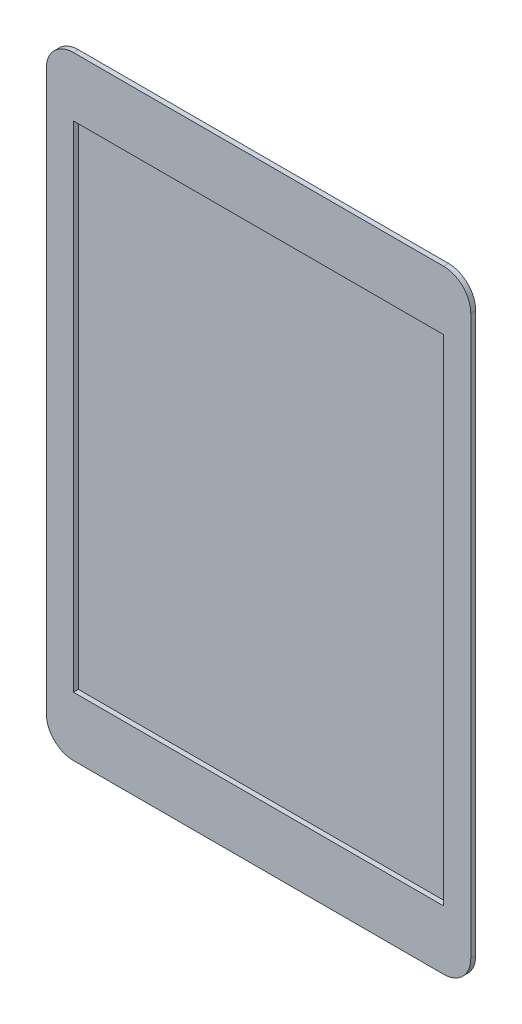
ISO-10303-21;
HEADER;
FILE_DESCRIPTION(('STEP AP214'),'2;1');
FILE_NAME('part.step','',(''),(''),'','','');
FILE_SCHEMA(('AUTOMOTIVE_DESIGN { 1 0 10303 214 1 1 1 1 }'));
ENDSEC;
DATA;
#1=APPLICATION_CONTEXT('core data for automotive mechanical design processes');
#2=APPLICATION_PROTOCOL_DEFINITION('international standard','automotive_design',2000,#1);
#3=PRODUCT_CONTEXT('',#1,'mechanical');
#4=PRODUCT('Part','Part','',(#3));
#5=PRODUCT_RELATED_PRODUCT_CATEGORY('part','',(#4));
#6=PRODUCT_DEFINITION_FORMATION('','',#4);
#7=PRODUCT_DEFINITION_CONTEXT('part definition',#1,'design');
#8=PRODUCT_DEFINITION('design','',#6,#7);
#9=PRODUCT_DEFINITION_SHAPE('','',#8);
#10=(LENGTH_UNIT() NAMED_UNIT(*) SI_UNIT(.MILLI.,.METRE.));
#11=(NAMED_UNIT(*) PLANE_ANGLE_UNIT() SI_UNIT($,.RADIAN.));
#12=(NAMED_UNIT(*) SI_UNIT($,.STERADIAN.) SOLID_ANGLE_UNIT());
#13=UNCERTAINTY_MEASURE_WITH_UNIT(LENGTH_MEASURE(1.E-05),#10,'distance_accuracy_value','');
#14=(GEOMETRIC_REPRESENTATION_CONTEXT(3) GLOBAL_UNCERTAINTY_ASSIGNED_CONTEXT((#13)) GLOBAL_UNIT_ASSIGNED_CONTEXT((#10,
#11,#12)) REPRESENTATION_CONTEXT('',''));
#15=CARTESIAN_POINT('',(0.,0.,0.));
#16=DIRECTION('',(0.,0.,1.));
#17=DIRECTION('',(1.,0.,0.));
#18=AXIS2_PLACEMENT_3D('',#15,#16,#17);
#19=CARTESIAN_POINT('',(75.05,-100.3,-0.1));
#20=DIRECTION('',(1.,0.,0.));
#21=DIRECTION('',(0.,0.,-1.));
#22=AXIS2_PLACEMENT_3D('',#19,#20,#21);
#23=PLANE('',#22);
#24=DIRECTION('',(0.,1.,0.));
#25=VECTOR('',#24,1.);
#26=CARTESIAN_POINT('',(75.05,-100.3,0.));
#27=LINE('',#26,#25);
#28=CARTESIAN_POINT('',(75.05,-100.3,0.));
#29=VERTEX_POINT('',#28);
#30=CARTESIAN_POINT('',(75.05,100.3,0.));
#31=VERTEX_POINT('',#30);
#32=EDGE_CURVE('E114',#29,#31,#27,.T.);
#33=ORIENTED_EDGE('',*,*,#32,.F.);
#34=DIRECTION('',(0.,0.,1.));
#35=VECTOR('',#34,1.);
#36=CARTESIAN_POINT('',(75.05,-100.3,-0.1));
#37=LINE('',#36,#35);
#38=CARTESIAN_POINT('',(75.05,-100.3,-0.1));
#39=VERTEX_POINT('',#38);
#40=EDGE_CURVE('E12',#39,#29,#37,.T.);
#41=ORIENTED_EDGE('',*,*,#40,.F.);
#42=DIRECTION('',(0.,1.,0.));
#43=VECTOR('',#42,1.);
#44=CARTESIAN_POINT('',(75.05,-100.3,-0.1));
#45=LINE('',#44,#43);
#46=CARTESIAN_POINT('',(75.05,100.3,-0.1));
#47=VERTEX_POINT('',#46);
#48=EDGE_CURVE('E108',#39,#47,#45,.T.);
#49=ORIENTED_EDGE('',*,*,#48,.T.);
#50=DIRECTION('',(0.,0.,1.));
#51=VECTOR('',#50,1.);
#52=CARTESIAN_POINT('',(75.05,100.3,-0.1));
#53=LINE('',#52,#51);
#54=EDGE_CURVE('E53',#47,#31,#53,.T.);
#55=ORIENTED_EDGE('',*,*,#54,.T.);
#56=EDGE_LOOP('',(#33,#41,#49,#55));
#57=FACE_BOUND('',#56,.T.);
#58=ADVANCED_FACE('F50',(#57),#23,.T.);
#59=CARTESIAN_POINT('',(-75.05,-100.3,-0.1));
#60=DIRECTION('',(0.,-1.,0.));
#61=DIRECTION('',(0.,0.,-1.));
#62=AXIS2_PLACEMENT_3D('',#59,#60,#61);
#63=PLANE('',#62);
#64=DIRECTION('',(1.,0.,0.));
#65=VECTOR('',#64,1.);
#66=CARTESIAN_POINT('',(-75.05,-100.3,0.));
#67=LINE('',#66,#65);
#68=CARTESIAN_POINT('',(-75.05,-100.3,0.));
#69=VERTEX_POINT('',#68);
#70=EDGE_CURVE('E110',#69,#29,#67,.T.);
#71=ORIENTED_EDGE('',*,*,#70,.F.);
#72=DIRECTION('',(0.,0.,1.));
#73=VECTOR('',#72,1.);
#74=CARTESIAN_POINT('',(-75.05,-100.3,-0.1));
#75=LINE('',#74,#73);
#76=CARTESIAN_POINT('',(-75.05,-100.3,-0.1));
#77=VERTEX_POINT('',#76);
#78=EDGE_CURVE('E59',#77,#69,#75,.T.);
#79=ORIENTED_EDGE('',*,*,#78,.F.);
#80=DIRECTION('',(1.,0.,0.));
#81=VECTOR('',#80,1.);
#82=CARTESIAN_POINT('',(-75.05,-100.3,-0.1));
#83=LINE('',#82,#81);
#84=EDGE_CURVE('E105',#77,#39,#83,.T.);
#85=ORIENTED_EDGE('',*,*,#84,.T.);
#86=ORIENTED_EDGE('',*,*,#40,.T.);
#87=EDGE_LOOP('',(#71,#79,#85,#86));
#88=FACE_BOUND('',#87,.T.);
#89=ADVANCED_FACE('F124',(#88),#63,.T.);
#90=CARTESIAN_POINT('',(-75.05,-100.3,-0.1));
#91=DIRECTION('',(-1.,0.,0.));
#92=DIRECTION('',(0.,0.,1.));
#93=AXIS2_PLACEMENT_3D('',#90,#91,#92);
#94=PLANE('',#93);
#95=DIRECTION('',(0.,-1.,0.));
#96=VECTOR('',#95,1.);
#97=CARTESIAN_POINT('',(-75.05,-100.3,0.));
#98=LINE('',#97,#96);
#99=CARTESIAN_POINT('',(-75.05,100.3,0.));
#100=VERTEX_POINT('',#99);
#101=EDGE_CURVE('E100',#100,#69,#98,.T.);
#102=ORIENTED_EDGE('',*,*,#101,.F.);
#103=DIRECTION('',(0.,0.,1.));
#104=VECTOR('',#103,1.);
#105=CARTESIAN_POINT('',(-75.05,100.3,-0.1));
#106=LINE('',#105,#104);
#107=CARTESIAN_POINT('',(-75.05,100.3,-0.1));
#108=VERTEX_POINT('',#107);
#109=EDGE_CURVE('E95',#108,#100,#106,.T.);
#110=ORIENTED_EDGE('',*,*,#109,.F.);
#111=DIRECTION('',(0.,-1.,0.));
#112=VECTOR('',#111,1.);
#113=CARTESIAN_POINT('',(-75.05,-100.3,-0.1));
#114=LINE('',#113,#112);
#115=EDGE_CURVE('E98',#108,#77,#114,.T.);
#116=ORIENTED_EDGE('',*,*,#115,.T.);
#117=ORIENTED_EDGE('',*,*,#78,.T.);
#118=EDGE_LOOP('',(#102,#110,#116,#117));
#119=FACE_BOUND('',#118,.T.);
#120=ADVANCED_FACE('F97',(#119),#94,.T.);
#121=CARTESIAN_POINT('',(-75.05,100.3,-0.1));
#122=DIRECTION('',(0.,1.,0.));
#123=DIRECTION('',(0.,0.,1.));
#124=AXIS2_PLACEMENT_3D('',#121,#122,#123);
#125=PLANE('',#124);
#126=DIRECTION('',(-1.,0.,0.));
#127=VECTOR('',#126,1.);
#128=CARTESIAN_POINT('',(-75.05,100.3,0.));
#129=LINE('',#128,#127);
#130=EDGE_CURVE('E117',#31,#100,#129,.T.);
#131=ORIENTED_EDGE('',*,*,#130,.F.);
#132=ORIENTED_EDGE('',*,*,#54,.F.);
#133=DIRECTION('',(-1.,0.,0.));
#134=VECTOR('',#133,1.);
#135=CARTESIAN_POINT('',(-75.05,100.3,-0.1));
#136=LINE('',#135,#134);
#137=EDGE_CURVE('E104',#47,#108,#136,.T.);
#138=ORIENTED_EDGE('',*,*,#137,.T.);
#139=ORIENTED_EDGE('',*,*,#109,.T.);
#140=EDGE_LOOP('',(#131,#132,#138,#139));
#141=FACE_BOUND('',#140,.T.);
#142=ADVANCED_FACE('F107',(#141),#125,.T.);
#143=CARTESIAN_POINT('',(0.,0.,-0.1));
#144=DIRECTION('',(0.,0.,-1.));
#145=DIRECTION('',(-1.,0.,0.));
#146=AXIS2_PLACEMENT_3D('',#143,#144,#145);
#147=PLANE('',#146);
#148=ORIENTED_EDGE('',*,*,#48,.F.);
#149=ORIENTED_EDGE('',*,*,#84,.F.);
#150=ORIENTED_EDGE('',*,*,#115,.F.);
#151=ORIENTED_EDGE('',*,*,#137,.F.);
#152=EDGE_LOOP('',(#148,#149,#150,#151));
#153=FACE_BOUND('',#152,.T.);
#154=ADVANCED_FACE('F103',(#153),#147,.T.);
#155=CARTESIAN_POINT('',(0.,0.,0.));
#156=DIRECTION('',(0.,0.,-1.));
#157=DIRECTION('',(-1.,0.,0.));
#158=AXIS2_PLACEMENT_3D('',#155,#156,#157);
#159=PLANE('',#158);
#160=ORIENTED_EDGE('',*,*,#32,.T.);
#161=ORIENTED_EDGE('',*,*,#130,.T.);
#162=ORIENTED_EDGE('',*,*,#101,.T.);
#163=ORIENTED_EDGE('',*,*,#70,.T.);
#164=EDGE_LOOP('',(#160,#161,#162,#163));
#165=FACE_BOUND('',#164,.T.);
#166=ADVANCED_FACE('F123',(#165),#159,.F.);
#167=CLOSED_SHELL('',(#58,#89,#120,#142,#154,#166));
#168=MANIFOLD_SOLID_BREP('B2',#167);
#169=CARTESIAN_POINT('',(-75.05,-113.3,2.));
#170=DIRECTION('',(0.,0.,1.));
#171=DIRECTION('',(1.,0.,0.));
#172=AXIS2_PLACEMENT_3D('',#169,#170,#171);
#173=PLANE('',#172);
#174=CARTESIAN_POINT('',(-75.05,-113.3,2.));
#175=DIRECTION('',(0.,0.,1.));
#176=DIRECTION('',(1.,0.,0.));
#177=AXIS2_PLACEMENT_3D('',#174,#175,#176);
#178=CIRCLE('',#177,11.);
#179=CARTESIAN_POINT('',(-86.05,-113.3,2.));
#180=VERTEX_POINT('',#179);
#181=CARTESIAN_POINT('',(-75.05,-124.3,2.));
#182=VERTEX_POINT('',#181);
#183=EDGE_CURVE('E304',#180,#182,#178,.T.);
#184=ORIENTED_EDGE('',*,*,#183,.T.);
#185=DIRECTION('',(1.,0.,0.));
#186=VECTOR('',#185,1.);
#187=CARTESIAN_POINT('',(-75.05,-124.3,2.));
#188=LINE('',#187,#186);
#189=CARTESIAN_POINT('',(75.05,-124.3,2.));
#190=VERTEX_POINT('',#189);
#191=EDGE_CURVE('E307',#182,#190,#188,.T.);
#192=ORIENTED_EDGE('',*,*,#191,.T.);
#193=CARTESIAN_POINT('',(75.05,-113.3,2.));
#194=DIRECTION('',(0.,0.,1.));
#195=DIRECTION('',(1.,0.,0.));
#196=AXIS2_PLACEMENT_3D('',#193,#194,#195);
#197=CIRCLE('',#196,11.);
#198=CARTESIAN_POINT('',(86.05,-113.3,2.));
#199=VERTEX_POINT('',#198);
#200=EDGE_CURVE('E310',#190,#199,#197,.T.);
#201=ORIENTED_EDGE('',*,*,#200,.T.);
#202=DIRECTION('',(0.,1.,0.));
#203=VECTOR('',#202,1.);
#204=CARTESIAN_POINT('',(86.05,113.3,2.));
#205=LINE('',#204,#203);
#206=CARTESIAN_POINT('',(86.05,113.3,2.));
#207=VERTEX_POINT('',#206);
#208=EDGE_CURVE('E312',#199,#207,#205,.T.);
#209=ORIENTED_EDGE('',*,*,#208,.T.);
#210=CARTESIAN_POINT('',(75.05,113.3,2.));
#211=DIRECTION('',(0.,0.,1.));
#212=DIRECTION('',(-1.,0.,0.));
#213=AXIS2_PLACEMENT_3D('',#210,#211,#212);
#214=CIRCLE('',#213,11.);
#215=CARTESIAN_POINT('',(75.05,124.3,2.));
#216=VERTEX_POINT('',#215);
#217=EDGE_CURVE('E314',#207,#216,#214,.T.);
#218=ORIENTED_EDGE('',*,*,#217,.T.);
#219=DIRECTION('',(-1.,0.,0.));
#220=VECTOR('',#219,1.);
#221=CARTESIAN_POINT('',(-75.05,124.3,2.));
#222=LINE('',#221,#220);
#223=CARTESIAN_POINT('',(-75.05,124.3,2.));
#224=VERTEX_POINT('',#223);
#225=EDGE_CURVE('E316',#216,#224,#222,.T.);
#226=ORIENTED_EDGE('',*,*,#225,.T.);
#227=CARTESIAN_POINT('',(-75.05,113.3,2.));
#228=DIRECTION('',(0.,0.,1.));
#229=DIRECTION('',(1.,0.,0.));
#230=AXIS2_PLACEMENT_3D('',#227,#228,#229);
#231=CIRCLE('',#230,11.);
#232=CARTESIAN_POINT('',(-86.05,113.3,2.));
#233=VERTEX_POINT('',#232);
#234=EDGE_CURVE('E318',#224,#233,#231,.T.);
#235=ORIENTED_EDGE('',*,*,#234,.T.);
#236=DIRECTION('',(0.,-1.,0.));
#237=VECTOR('',#236,1.);
#238=CARTESIAN_POINT('',(-86.05,113.3,2.));
#239=LINE('',#238,#237);
#240=EDGE_CURVE('E320',#233,#180,#239,.T.);
#241=ORIENTED_EDGE('',*,*,#240,.T.);
#242=EDGE_LOOP('',(#184,#192,#201,#209,#218,#226,#235,#241));
#243=FACE_BOUND('',#242,.T.);
#244=DIRECTION('',(-1.,0.,0.));
#245=VECTOR('',#244,1.);
#246=CARTESIAN_POINT('',(-75.05,100.3,2.));
#247=LINE('',#246,#245);
#248=CARTESIAN_POINT('',(75.05,100.3,2.));
#249=VERTEX_POINT('',#248);
#250=CARTESIAN_POINT('',(-75.05,100.3,2.));
#251=VERTEX_POINT('',#250);
#252=EDGE_CURVE('E274',#249,#251,#247,.T.);
#253=ORIENTED_EDGE('',*,*,#252,.F.);
#254=DIRECTION('',(0.,1.,0.));
#255=VECTOR('',#254,1.);
#256=CARTESIAN_POINT('',(75.05,100.3,2.));
#257=LINE('',#256,#255);
#258=CARTESIAN_POINT('',(75.05,-100.3,2.));
#259=VERTEX_POINT('',#258);
#260=EDGE_CURVE('E266',#259,#249,#257,.T.);
#261=ORIENTED_EDGE('',*,*,#260,.F.);
#262=DIRECTION('',(1.,0.,0.));
#263=VECTOR('',#262,1.);
#264=CARTESIAN_POINT('',(-75.05,-100.3,2.));
#265=LINE('',#264,#263);
#266=CARTESIAN_POINT('',(-75.05,-100.3,2.));
#267=VERTEX_POINT('',#266);
#268=EDGE_CURVE('E288',#267,#259,#265,.T.);
#269=ORIENTED_EDGE('',*,*,#268,.F.);
#270=DIRECTION('',(0.,-1.,0.));
#271=VECTOR('',#270,1.);
#272=CARTESIAN_POINT('',(-75.05,100.3,2.));
#273=LINE('',#272,#271);
#274=EDGE_CURVE('E286',#251,#267,#273,.T.);
#275=ORIENTED_EDGE('',*,*,#274,.F.);
#276=EDGE_LOOP('',(#253,#261,#269,#275));
#277=FACE_BOUND('',#276,.T.);
#278=ADVANCED_FACE('F177',(#243,#277),#173,.T.);
#279=CARTESIAN_POINT('',(-75.05,-113.3,0.));
#280=DIRECTION('',(0.,0.,1.));
#281=DIRECTION('',(1.,0.,0.));
#282=AXIS2_PLACEMENT_3D('',#279,#280,#281);
#283=PLANE('',#282);
#284=CARTESIAN_POINT('',(0.,112.85975777195,0.));
#285=DIRECTION('',(0.,0.,-1.));
#286=DIRECTION('',(-1.,0.,0.));
#287=AXIS2_PLACEMENT_3D('',#284,#285,#286);
#288=CIRCLE('',#287,1.5);
#289=CARTESIAN_POINT('',(-1.5,112.85975777195,0.));
#290=VERTEX_POINT('',#289);
#291=EDGE_CURVE('E637',#290,#290,#288,.T.);
#292=ORIENTED_EDGE('',*,*,#291,.F.);
#293=EDGE_LOOP('',(#292));
#294=FACE_BOUND('',#293,.T.);
#295=CARTESIAN_POINT('',(0.,-111.8,0.));
#296=DIRECTION('',(0.,0.,1.));
#297=DIRECTION('',(1.,0.,0.));
#298=AXIS2_PLACEMENT_3D('',#295,#296,#297);
#299=CIRCLE('',#298,5.501);
#300=CARTESIAN_POINT('',(5.501,-111.8,0.));
#301=VERTEX_POINT('',#300);
#302=EDGE_CURVE('E370',#301,#301,#299,.T.);
#303=ORIENTED_EDGE('',*,*,#302,.T.);
#304=EDGE_LOOP('',(#303));
#305=FACE_BOUND('',#304,.T.);
#306=CARTESIAN_POINT('',(-75.05,-113.3,0.));
#307=DIRECTION('',(0.,0.,1.));
#308=DIRECTION('',(1.,0.,0.));
#309=AXIS2_PLACEMENT_3D('',#306,#307,#308);
#310=CIRCLE('',#309,11.);
#311=CARTESIAN_POINT('',(-86.05,-113.3,0.));
#312=VERTEX_POINT('',#311);
#313=CARTESIAN_POINT('',(-75.05,-124.3,0.));
#314=VERTEX_POINT('',#313);
#315=EDGE_CURVE('E282',#312,#314,#310,.T.);
#316=ORIENTED_EDGE('',*,*,#315,.F.);
#317=DIRECTION('',(0.,-1.,0.));
#318=VECTOR('',#317,1.);
#319=CARTESIAN_POINT('',(-86.05,113.3,0.));
#320=LINE('',#319,#318);
#321=CARTESIAN_POINT('',(-86.05,113.3,0.));
#322=VERTEX_POINT('',#321);
#323=EDGE_CURVE('E308',#322,#312,#320,.T.);
#324=ORIENTED_EDGE('',*,*,#323,.F.);
#325=CARTESIAN_POINT('',(-75.05,113.3,0.));
#326=DIRECTION('',(0.,0.,1.));
#327=DIRECTION('',(1.,0.,0.));
#328=AXIS2_PLACEMENT_3D('',#325,#326,#327);
#329=CIRCLE('',#328,11.);
#330=CARTESIAN_POINT('',(-75.05,124.3,0.));
#331=VERTEX_POINT('',#330);
#332=EDGE_CURVE('E335',#331,#322,#329,.T.);
#333=ORIENTED_EDGE('',*,*,#332,.F.);
#334=DIRECTION('',(-1.,0.,0.));
#335=VECTOR('',#334,1.);
#336=CARTESIAN_POINT('',(-75.05,124.3,0.));
#337=LINE('',#336,#335);
#338=CARTESIAN_POINT('',(75.05,124.3,0.));
#339=VERTEX_POINT('',#338);
#340=EDGE_CURVE('E333',#339,#331,#337,.T.);
#341=ORIENTED_EDGE('',*,*,#340,.F.);
#342=CARTESIAN_POINT('',(75.05,113.3,0.));
#343=DIRECTION('',(0.,0.,1.));
#344=DIRECTION('',(-1.,0.,0.));
#345=AXIS2_PLACEMENT_3D('',#342,#343,#344);
#346=CIRCLE('',#345,11.);
#347=CARTESIAN_POINT('',(86.05,113.3,0.));
#348=VERTEX_POINT('',#347);
#349=EDGE_CURVE('E331',#348,#339,#346,.T.);
#350=ORIENTED_EDGE('',*,*,#349,.F.);
#351=DIRECTION('',(0.,1.,0.));
#352=VECTOR('',#351,1.);
#353=CARTESIAN_POINT('',(86.05,113.3,0.));
#354=LINE('',#353,#352);
#355=CARTESIAN_POINT('',(86.05,-113.3,0.));
#356=VERTEX_POINT('',#355);
#357=EDGE_CURVE('E329',#356,#348,#354,.T.);
#358=ORIENTED_EDGE('',*,*,#357,.F.);
#359=CARTESIAN_POINT('',(75.05,-113.3,0.));
#360=DIRECTION('',(0.,0.,1.));
#361=DIRECTION('',(1.,0.,0.));
#362=AXIS2_PLACEMENT_3D('',#359,#360,#361);
#363=CIRCLE('',#362,11.);
#364=CARTESIAN_POINT('',(75.05,-124.3,0.));
#365=VERTEX_POINT('',#364);
#366=EDGE_CURVE('E327',#365,#356,#363,.T.);
#367=ORIENTED_EDGE('',*,*,#366,.F.);
#368=DIRECTION('',(1.,0.,0.));
#369=VECTOR('',#368,1.);
#370=CARTESIAN_POINT('',(-75.05,-124.3,0.));
#371=LINE('',#370,#369);
#372=EDGE_CURVE('E325',#314,#365,#371,.T.);
#373=ORIENTED_EDGE('',*,*,#372,.F.);
#374=EDGE_LOOP('',(#316,#324,#333,#341,#350,#358,#367,#373));
#375=FACE_BOUND('',#374,.T.);
#376=DIRECTION('',(0.,1.,0.));
#377=VECTOR('',#376,1.);
#378=CARTESIAN_POINT('',(75.05,100.3,0.));
#379=LINE('',#378,#377);
#380=CARTESIAN_POINT('',(75.05,-100.3,0.));
#381=VERTEX_POINT('',#380);
#382=CARTESIAN_POINT('',(75.05,100.3,0.));
#383=VERTEX_POINT('',#382);
#384=EDGE_CURVE('E200',#381,#383,#379,.T.);
#385=ORIENTED_EDGE('',*,*,#384,.T.);
#386=DIRECTION('',(-1.,0.,0.));
#387=VECTOR('',#386,1.);
#388=CARTESIAN_POINT('',(-75.05,100.3,0.));
#389=LINE('',#388,#387);
#390=CARTESIAN_POINT('',(-75.05,100.3,0.));
#391=VERTEX_POINT('',#390);
#392=EDGE_CURVE('E281',#383,#391,#389,.T.);
#393=ORIENTED_EDGE('',*,*,#392,.T.);
#394=DIRECTION('',(0.,-1.,0.));
#395=VECTOR('',#394,1.);
#396=CARTESIAN_POINT('',(-75.05,100.3,0.));
#397=LINE('',#396,#395);
#398=CARTESIAN_POINT('',(-75.05,-100.3,0.));
#399=VERTEX_POINT('',#398);
#400=EDGE_CURVE('E296',#391,#399,#397,.T.);
#401=ORIENTED_EDGE('',*,*,#400,.T.);
#402=DIRECTION('',(1.,0.,0.));
#403=VECTOR('',#402,1.);
#404=CARTESIAN_POINT('',(-75.05,-100.3,0.));
#405=LINE('',#404,#403);
#406=EDGE_CURVE('E275',#399,#381,#405,.T.);
#407=ORIENTED_EDGE('',*,*,#406,.T.);
#408=EDGE_LOOP('',(#385,#393,#401,#407));
#409=FACE_BOUND('',#408,.T.);
#410=ADVANCED_FACE('F399',(#294,#305,#375,#409),#283,.F.);
#411=CARTESIAN_POINT('',(-75.05,-113.3,2.));
#412=DIRECTION('',(0.,0.,-1.));
#413=DIRECTION('',(-1.,0.,0.));
#414=AXIS2_PLACEMENT_3D('',#411,#412,#413);
#415=CYLINDRICAL_SURFACE('',#414,11.);
#416=ORIENTED_EDGE('',*,*,#315,.T.);
#417=DIRECTION('',(0.,0.,-1.));
#418=VECTOR('',#417,1.);
#419=CARTESIAN_POINT('',(-75.05,-124.3,2.));
#420=LINE('',#419,#418);
#421=EDGE_CURVE('E358',#182,#314,#420,.T.);
#422=ORIENTED_EDGE('',*,*,#421,.F.);
#423=ORIENTED_EDGE('',*,*,#183,.F.);
#424=DIRECTION('',(0.,0.,-1.));
#425=VECTOR('',#424,1.);
#426=CARTESIAN_POINT('',(-86.05,-113.3,2.));
#427=LINE('',#426,#425);
#428=EDGE_CURVE('E322',#180,#312,#427,.T.);
#429=ORIENTED_EDGE('',*,*,#428,.T.);
#430=EDGE_LOOP('',(#416,#422,#423,#429));
#431=FACE_BOUND('',#430,.T.);
#432=ADVANCED_FACE('F405',(#431),#415,.T.);
#433=CARTESIAN_POINT('',(-75.05,-124.3,2.));
#434=DIRECTION('',(0.,1.,0.));
#435=DIRECTION('',(0.,0.,1.));
#436=AXIS2_PLACEMENT_3D('',#433,#434,#435);
#437=PLANE('',#436);
#438=ORIENTED_EDGE('',*,*,#372,.T.);
#439=DIRECTION('',(0.,0.,-1.));
#440=VECTOR('',#439,1.);
#441=CARTESIAN_POINT('',(75.05,-124.3,2.));
#442=LINE('',#441,#440);
#443=EDGE_CURVE('E355',#190,#365,#442,.T.);
#444=ORIENTED_EDGE('',*,*,#443,.F.);
#445=ORIENTED_EDGE('',*,*,#191,.F.);
#446=ORIENTED_EDGE('',*,*,#421,.T.);
#447=EDGE_LOOP('',(#438,#444,#445,#446));
#448=FACE_BOUND('',#447,.T.);
#449=ADVANCED_FACE('F435',(#448),#437,.F.);
#450=CARTESIAN_POINT('',(75.05,-113.3,2.));
#451=DIRECTION('',(0.,0.,-1.));
#452=DIRECTION('',(-1.,0.,0.));
#453=AXIS2_PLACEMENT_3D('',#450,#451,#452);
#454=CYLINDRICAL_SURFACE('',#453,11.);
#455=ORIENTED_EDGE('',*,*,#366,.T.);
#456=DIRECTION('',(0.,0.,-1.));
#457=VECTOR('',#456,1.);
#458=CARTESIAN_POINT('',(86.05,-113.3,2.));
#459=LINE('',#458,#457);
#460=EDGE_CURVE('E352',#199,#356,#459,.T.);
#461=ORIENTED_EDGE('',*,*,#460,.F.);
#462=ORIENTED_EDGE('',*,*,#200,.F.);
#463=ORIENTED_EDGE('',*,*,#443,.T.);
#464=EDGE_LOOP('',(#455,#461,#462,#463));
#465=FACE_BOUND('',#464,.T.);
#466=ADVANCED_FACE('F431',(#465),#454,.T.);
#467=CARTESIAN_POINT('',(86.05,113.3,2.));
#468=DIRECTION('',(-1.,0.,0.));
#469=DIRECTION('',(0.,-1.,0.));
#470=AXIS2_PLACEMENT_3D('',#467,#468,#469);
#471=PLANE('',#470);
#472=ORIENTED_EDGE('',*,*,#357,.T.);
#473=DIRECTION('',(0.,0.,-1.));
#474=VECTOR('',#473,1.);
#475=CARTESIAN_POINT('',(86.05,113.3,2.));
#476=LINE('',#475,#474);
#477=EDGE_CURVE('E349',#207,#348,#476,.T.);
#478=ORIENTED_EDGE('',*,*,#477,.F.);
#479=ORIENTED_EDGE('',*,*,#208,.F.);
#480=ORIENTED_EDGE('',*,*,#460,.T.);
#481=EDGE_LOOP('',(#472,#478,#479,#480));
#482=FACE_BOUND('',#481,.T.);
#483=ADVANCED_FACE('F427',(#482),#471,.F.);
#484=CARTESIAN_POINT('',(75.05,113.3,2.));
#485=DIRECTION('',(0.,0.,-1.));
#486=DIRECTION('',(-1.,0.,0.));
#487=AXIS2_PLACEMENT_3D('',#484,#485,#486);
#488=CYLINDRICAL_SURFACE('',#487,11.);
#489=ORIENTED_EDGE('',*,*,#349,.T.);
#490=DIRECTION('',(0.,0.,-1.));
#491=VECTOR('',#490,1.);
#492=CARTESIAN_POINT('',(75.05,124.3,2.));
#493=LINE('',#492,#491);
#494=EDGE_CURVE('E346',#216,#339,#493,.T.);
#495=ORIENTED_EDGE('',*,*,#494,.F.);
#496=ORIENTED_EDGE('',*,*,#217,.F.);
#497=ORIENTED_EDGE('',*,*,#477,.T.);
#498=EDGE_LOOP('',(#489,#495,#496,#497));
#499=FACE_BOUND('',#498,.T.);
#500=ADVANCED_FACE('F423',(#499),#488,.T.);
#501=CARTESIAN_POINT('',(-75.05,124.3,2.));
#502=DIRECTION('',(0.,-1.,0.));
#503=DIRECTION('',(0.,0.,-1.));
#504=AXIS2_PLACEMENT_3D('',#501,#502,#503);
#505=PLANE('',#504);
#506=ORIENTED_EDGE('',*,*,#340,.T.);
#507=DIRECTION('',(0.,0.,-1.));
#508=VECTOR('',#507,1.);
#509=CARTESIAN_POINT('',(-75.05,124.3,2.));
#510=LINE('',#509,#508);
#511=EDGE_CURVE('E343',#224,#331,#510,.T.);
#512=ORIENTED_EDGE('',*,*,#511,.F.);
#513=ORIENTED_EDGE('',*,*,#225,.F.);
#514=ORIENTED_EDGE('',*,*,#494,.T.);
#515=EDGE_LOOP('',(#506,#512,#513,#514));
#516=FACE_BOUND('',#515,.T.);
#517=ADVANCED_FACE('F419',(#516),#505,.F.);
#518=CARTESIAN_POINT('',(-75.05,113.3,2.));
#519=DIRECTION('',(0.,0.,-1.));
#520=DIRECTION('',(-1.,0.,0.));
#521=AXIS2_PLACEMENT_3D('',#518,#519,#520);
#522=CYLINDRICAL_SURFACE('',#521,11.);
#523=ORIENTED_EDGE('',*,*,#332,.T.);
#524=DIRECTION('',(0.,0.,-1.));
#525=VECTOR('',#524,1.);
#526=CARTESIAN_POINT('',(-86.05,113.3,2.));
#527=LINE('',#526,#525);
#528=EDGE_CURVE('E340',#233,#322,#527,.T.);
#529=ORIENTED_EDGE('',*,*,#528,.F.);
#530=ORIENTED_EDGE('',*,*,#234,.F.);
#531=ORIENTED_EDGE('',*,*,#511,.T.);
#532=EDGE_LOOP('',(#523,#529,#530,#531));
#533=FACE_BOUND('',#532,.T.);
#534=ADVANCED_FACE('F415',(#533),#522,.T.);
#535=CARTESIAN_POINT('',(-86.05,113.3,2.));
#536=DIRECTION('',(1.,0.,0.));
#537=DIRECTION('',(0.,1.,0.));
#538=AXIS2_PLACEMENT_3D('',#535,#536,#537);
#539=PLANE('',#538);
#540=ORIENTED_EDGE('',*,*,#323,.T.);
#541=ORIENTED_EDGE('',*,*,#428,.F.);
#542=ORIENTED_EDGE('',*,*,#240,.F.);
#543=ORIENTED_EDGE('',*,*,#528,.T.);
#544=EDGE_LOOP('',(#540,#541,#542,#543));
#545=FACE_BOUND('',#544,.T.);
#546=ADVANCED_FACE('F412',(#545),#539,.F.);
#547=CARTESIAN_POINT('',(75.05,100.3,2.));
#548=DIRECTION('',(-1.,0.,0.));
#549=DIRECTION('',(0.,-1.,0.));
#550=AXIS2_PLACEMENT_3D('',#547,#548,#549);
#551=PLANE('',#550);
#552=ORIENTED_EDGE('',*,*,#384,.F.);
#553=DIRECTION('',(0.,0.,-1.));
#554=VECTOR('',#553,1.);
#555=CARTESIAN_POINT('',(75.05,-100.3,2.));
#556=LINE('',#555,#554);
#557=EDGE_CURVE('E270',#259,#381,#556,.T.);
#558=ORIENTED_EDGE('',*,*,#557,.F.);
#559=ORIENTED_EDGE('',*,*,#260,.T.);
#560=DIRECTION('',(0.,0.,-1.));
#561=VECTOR('',#560,1.);
#562=CARTESIAN_POINT('',(75.05,100.3,2.));
#563=LINE('',#562,#561);
#564=EDGE_CURVE('E269',#249,#383,#563,.T.);
#565=ORIENTED_EDGE('',*,*,#564,.T.);
#566=EDGE_LOOP('',(#552,#558,#559,#565));
#567=FACE_BOUND('',#566,.T.);
#568=ADVANCED_FACE('F268',(#567),#551,.T.);
#569=CARTESIAN_POINT('',(-75.05,100.3,2.));
#570=DIRECTION('',(0.,-1.,0.));
#571=DIRECTION('',(0.,0.,-1.));
#572=AXIS2_PLACEMENT_3D('',#569,#570,#571);
#573=PLANE('',#572);
#574=ORIENTED_EDGE('',*,*,#392,.F.);
#575=ORIENTED_EDGE('',*,*,#564,.F.);
#576=ORIENTED_EDGE('',*,*,#252,.T.);
#577=DIRECTION('',(0.,0.,-1.));
#578=VECTOR('',#577,1.);
#579=CARTESIAN_POINT('',(-75.05,100.3,2.));
#580=LINE('',#579,#578);
#581=EDGE_CURVE('E283',#251,#391,#580,.T.);
#582=ORIENTED_EDGE('',*,*,#581,.T.);
#583=EDGE_LOOP('',(#574,#575,#576,#582));
#584=FACE_BOUND('',#583,.T.);
#585=ADVANCED_FACE('F278',(#584),#573,.T.);
#586=CARTESIAN_POINT('',(-75.05,100.3,2.));
#587=DIRECTION('',(1.,0.,0.));
#588=DIRECTION('',(0.,1.,0.));
#589=AXIS2_PLACEMENT_3D('',#586,#587,#588);
#590=PLANE('',#589);
#591=ORIENTED_EDGE('',*,*,#400,.F.);
#592=ORIENTED_EDGE('',*,*,#581,.F.);
#593=ORIENTED_EDGE('',*,*,#274,.T.);
#594=DIRECTION('',(0.,0.,-1.));
#595=VECTOR('',#594,1.);
#596=CARTESIAN_POINT('',(-75.05,-100.3,2.));
#597=LINE('',#596,#595);
#598=EDGE_CURVE('E192',#267,#399,#597,.T.);
#599=ORIENTED_EDGE('',*,*,#598,.T.);
#600=EDGE_LOOP('',(#591,#592,#593,#599));
#601=FACE_BOUND('',#600,.T.);
#602=ADVANCED_FACE('F467',(#601),#590,.T.);
#603=CARTESIAN_POINT('',(-75.05,-100.3,2.));
#604=DIRECTION('',(0.,1.,0.));
#605=DIRECTION('',(0.,0.,1.));
#606=AXIS2_PLACEMENT_3D('',#603,#604,#605);
#607=PLANE('',#606);
#608=ORIENTED_EDGE('',*,*,#406,.F.);
#609=ORIENTED_EDGE('',*,*,#598,.F.);
#610=ORIENTED_EDGE('',*,*,#268,.T.);
#611=ORIENTED_EDGE('',*,*,#557,.T.);
#612=EDGE_LOOP('',(#608,#609,#610,#611));
#613=FACE_BOUND('',#612,.T.);
#614=ADVANCED_FACE('F458',(#613),#607,.T.);
#615=CARTESIAN_POINT('',(0.,-111.8,1.));
#616=DIRECTION('',(0.,0.,-1.));
#617=DIRECTION('',(-1.,0.,0.));
#618=AXIS2_PLACEMENT_3D('',#615,#616,#617);
#619=CYLINDRICAL_SURFACE('',#618,5.5);
#620=CARTESIAN_POINT('',(0.,-111.8,0.999));
#621=DIRECTION('',(0.,0.,-1.));
#622=DIRECTION('',(-1.,0.,0.));
#623=AXIS2_PLACEMENT_3D('',#620,#621,#622);
#624=CIRCLE('',#623,5.5);
#625=CARTESIAN_POINT('',(-5.5,-111.8,0.999));
#626=VERTEX_POINT('',#625);
#627=EDGE_CURVE('E376',#626,#626,#624,.F.);
#628=ORIENTED_EDGE('',*,*,#627,.T.);
#629=EDGE_LOOP('',(#628));
#630=FACE_BOUND('',#629,.T.);
#631=CARTESIAN_POINT('',(0.,-111.8,0.000999999999999916));
#632=DIRECTION('',(0.,0.,1.));
#633=DIRECTION('',(1.,0.,0.));
#634=AXIS2_PLACEMENT_3D('',#631,#632,#633);
#635=CIRCLE('',#634,5.5);
#636=CARTESIAN_POINT('',(5.5,-111.8,0.000999999999999916));
#637=VERTEX_POINT('',#636);
#638=EDGE_CURVE('E367',#637,#637,#635,.F.);
#639=ORIENTED_EDGE('',*,*,#638,.T.);
#640=EDGE_LOOP('',(#639));
#641=FACE_BOUND('',#640,.T.);
#642=ADVANCED_FACE('F455',(#630,#641),#619,.F.);
#643=CARTESIAN_POINT('',(0.,-111.8,1.));
#644=DIRECTION('',(0.,0.,-1.));
#645=DIRECTION('',(-1.,0.,0.));
#646=AXIS2_PLACEMENT_3D('',#643,#644,#645);
#647=PLANE('',#646);
#648=CARTESIAN_POINT('',(0.,-111.8,1.));
#649=DIRECTION('',(0.,0.,-1.));
#650=DIRECTION('',(-1.,0.,0.));
#651=AXIS2_PLACEMENT_3D('',#648,#649,#650);
#652=CIRCLE('',#651,4.751);
#653=CARTESIAN_POINT('',(-4.751,-111.8,1.));
#654=VERTEX_POINT('',#653);
#655=EDGE_CURVE('E48',#654,#654,#652,.F.);
#656=ORIENTED_EDGE('',*,*,#655,.T.);
#657=EDGE_LOOP('',(#656));
#658=FACE_BOUND('',#657,.T.);
#659=CARTESIAN_POINT('',(0.,-111.8,1.));
#660=DIRECTION('',(0.,0.,-1.));
#661=DIRECTION('',(-1.,0.,0.));
#662=AXIS2_PLACEMENT_3D('',#659,#660,#661);
#663=CIRCLE('',#662,5.499);
#664=CARTESIAN_POINT('',(-5.499,-111.8,1.));
#665=VERTEX_POINT('',#664);
#666=EDGE_CURVE('E373',#665,#665,#663,.T.);
#667=ORIENTED_EDGE('',*,*,#666,.T.);
#668=EDGE_LOOP('',(#667));
#669=FACE_BOUND('',#668,.T.);
#670=ADVANCED_FACE('F457',(#658,#669),#647,.T.);
#671=CARTESIAN_POINT('',(0.,-111.8,1.));
#672=DIRECTION('',(0.,0.,-1.));
#673=DIRECTION('',(-1.,0.,0.));
#674=AXIS2_PLACEMENT_3D('',#671,#672,#673);
#675=CYLINDRICAL_SURFACE('',#674,4.75);
#676=CARTESIAN_POINT('',(0.,-111.8,0.999));
#677=DIRECTION('',(0.,0.,-1.));
#678=DIRECTION('',(-1.,0.,0.));
#679=AXIS2_PLACEMENT_3D('',#676,#677,#678);
#680=CIRCLE('',#679,4.75);
#681=CARTESIAN_POINT('',(-4.75,-111.8,0.999));
#682=VERTEX_POINT('',#681);
#683=EDGE_CURVE('E185',#682,#682,#680,.T.);
#684=ORIENTED_EDGE('',*,*,#683,.T.);
#685=EDGE_LOOP('',(#684));
#686=FACE_BOUND('',#685,.T.);
#687=CARTESIAN_POINT('',(0.,-111.8,0.000999999999999916));
#688=DIRECTION('',(0.,0.,1.));
#689=DIRECTION('',(1.,0.,0.));
#690=AXIS2_PLACEMENT_3D('',#687,#688,#689);
#691=CIRCLE('',#690,4.75);
#692=CARTESIAN_POINT('',(4.75,-111.8,0.000999999999999916));
#693=VERTEX_POINT('',#692);
#694=EDGE_CURVE('E364',#693,#693,#691,.T.);
#695=ORIENTED_EDGE('',*,*,#694,.T.);
#696=EDGE_LOOP('',(#695));
#697=FACE_BOUND('',#696,.T.);
#698=ADVANCED_FACE('F381',(#686,#697),#675,.T.);
#699=CARTESIAN_POINT('',(0.,-111.8,0.));
#700=DIRECTION('',(0.,0.,1.));
#701=DIRECTION('',(1.,0.,0.));
#702=AXIS2_PLACEMENT_3D('',#699,#700,#701);
#703=CIRCLE('',#702,4.749);
#704=CARTESIAN_POINT('',(4.749,-111.8,0.));
#705=VERTEX_POINT('',#704);
#706=EDGE_CURVE('E361',#705,#705,#703,.F.);
#707=ORIENTED_EDGE('',*,*,#706,.T.);
#708=EDGE_LOOP('',(#707));
#709=FACE_BOUND('',#708,.T.);
#710=ADVANCED_FACE('F408',(#709),#283,.F.);
#711=CARTESIAN_POINT('',(0.,-111.8,0.000999999999999916));
#712=DIRECTION('',(0.,0.,1.));
#713=DIRECTION('',(1.,0.,0.));
#714=AXIS2_PLACEMENT_3D('',#711,#712,#713);
#715=TOROIDAL_SURFACE('',#714,4.749,0.001);
#716=ORIENTED_EDGE('',*,*,#694,.F.);
#717=EDGE_LOOP('',(#716));
#718=FACE_BOUND('',#717,.T.);
#719=ORIENTED_EDGE('',*,*,#706,.F.);
#720=EDGE_LOOP('',(#719));
#721=FACE_BOUND('',#720,.T.);
#722=ADVANCED_FACE('F443',(#718,#721),#715,.T.);
#723=CARTESIAN_POINT('',(0.,-111.8,0.000999999999999916));
#724=DIRECTION('',(0.,0.,1.));
#725=DIRECTION('',(1.,0.,0.));
#726=AXIS2_PLACEMENT_3D('',#723,#724,#725);
#727=TOROIDAL_SURFACE('',#726,5.501,0.001);
#728=ORIENTED_EDGE('',*,*,#302,.F.);
#729=EDGE_LOOP('',(#728));
#730=FACE_BOUND('',#729,.T.);
#731=ORIENTED_EDGE('',*,*,#638,.F.);
#732=EDGE_LOOP('',(#731));
#733=FACE_BOUND('',#732,.T.);
#734=ADVANCED_FACE('F395',(#730,#733),#727,.T.);
#735=CARTESIAN_POINT('',(0.,-111.8,0.999));
#736=DIRECTION('',(0.,0.,-1.));
#737=DIRECTION('',(-1.,0.,0.));
#738=AXIS2_PLACEMENT_3D('',#735,#736,#737);
#739=TOROIDAL_SURFACE('',#738,5.499,0.001);
#740=ORIENTED_EDGE('',*,*,#627,.F.);
#741=EDGE_LOOP('',(#740));
#742=FACE_BOUND('',#741,.T.);
#743=ORIENTED_EDGE('',*,*,#666,.F.);
#744=EDGE_LOOP('',(#743));
#745=FACE_BOUND('',#744,.T.);
#746=ADVANCED_FACE('F386',(#742,#745),#739,.F.);
#747=CARTESIAN_POINT('',(0.,-111.8,0.999));
#748=DIRECTION('',(0.,0.,-1.));
#749=DIRECTION('',(-1.,0.,0.));
#750=AXIS2_PLACEMENT_3D('',#747,#748,#749);
#751=TOROIDAL_SURFACE('',#750,4.751,0.001);
#752=ORIENTED_EDGE('',*,*,#655,.F.);
#753=EDGE_LOOP('',(#752));
#754=FACE_BOUND('',#753,.T.);
#755=ORIENTED_EDGE('',*,*,#683,.F.);
#756=EDGE_LOOP('',(#755));
#757=FACE_BOUND('',#756,.T.);
#758=ADVANCED_FACE('F179',(#754,#757),#751,.F.);
#759=CARTESIAN_POINT('',(0.,112.85975777195,0.5));
#760=DIRECTION('',(0.,0.,-1.));
#761=DIRECTION('',(-1.,0.,0.));
#762=AXIS2_PLACEMENT_3D('',#759,#760,#761);
#763=CYLINDRICAL_SURFACE('',#762,1.5);
#764=CARTESIAN_POINT('',(0.,112.85975777195,0.5));
#765=DIRECTION('',(0.,0.,-1.));
#766=DIRECTION('',(-1.,0.,0.));
#767=AXIS2_PLACEMENT_3D('',#764,#765,#766);
#768=CIRCLE('',#767,1.5);
#769=CARTESIAN_POINT('',(-1.5,112.85975777195,0.5));
#770=VERTEX_POINT('',#769);
#771=EDGE_CURVE('E294',#770,#770,#768,.T.);
#772=ORIENTED_EDGE('',*,*,#771,.F.);
#773=EDGE_LOOP('',(#772));
#774=FACE_BOUND('',#773,.T.);
#775=ORIENTED_EDGE('',*,*,#291,.T.);
#776=EDGE_LOOP('',(#775));
#777=FACE_BOUND('',#776,.T.);
#778=ADVANCED_FACE('F385',(#774,#777),#763,.F.);
#779=CARTESIAN_POINT('',(0.,112.85975777195,0.5));
#780=DIRECTION('',(0.,0.,-1.));
#781=DIRECTION('',(-1.,0.,0.));
#782=AXIS2_PLACEMENT_3D('',#779,#780,#781);
#783=PLANE('',#782);
#784=ORIENTED_EDGE('',*,*,#771,.T.);
#785=EDGE_LOOP('',(#784));
#786=FACE_BOUND('',#785,.T.);
#787=ADVANCED_FACE('F392',(#786),#783,.T.);
#788=CLOSED_SHELL('',(#278,#410,#432,#449,#466,#483,#500,#517,#534,#546,#568,#585,#602,#614,
#642,#670,#698,#710,#722,#734,#746,#758,#778,#787));
#789=MANIFOLD_SOLID_BREP('B6',#788);
#790=ADVANCED_BREP_SHAPE_REPRESENTATION('',(#18,#168,#789),#14);
#791=SHAPE_DEFINITION_REPRESENTATION(#9,#790);
ENDSEC;
END-ISO-10303-21;
